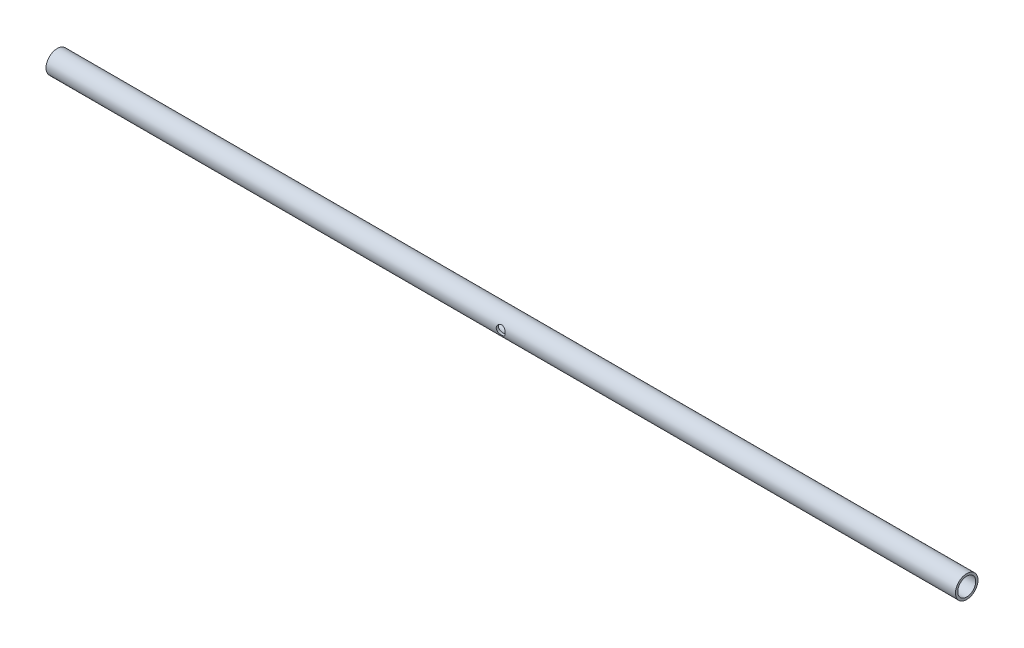
ISO-10303-21;
HEADER;
FILE_DESCRIPTION(('STEP AP214'),'2;1');
FILE_NAME('part.step','',(''),(''),'','','');
FILE_SCHEMA(('AUTOMOTIVE_DESIGN { 1 0 10303 214 1 1 1 1 }'));
ENDSEC;
DATA;
#1=APPLICATION_CONTEXT('core data for automotive mechanical design processes');
#2=APPLICATION_PROTOCOL_DEFINITION('international standard','automotive_design',2000,#1);
#3=PRODUCT_CONTEXT('',#1,'mechanical');
#4=PRODUCT('Part','Part','',(#3));
#5=PRODUCT_RELATED_PRODUCT_CATEGORY('part','',(#4));
#6=PRODUCT_DEFINITION_FORMATION('','',#4);
#7=PRODUCT_DEFINITION_CONTEXT('part definition',#1,'design');
#8=PRODUCT_DEFINITION('design','',#6,#7);
#9=PRODUCT_DEFINITION_SHAPE('','',#8);
#10=(LENGTH_UNIT() NAMED_UNIT(*) SI_UNIT(.MILLI.,.METRE.));
#11=(NAMED_UNIT(*) PLANE_ANGLE_UNIT() SI_UNIT($,.RADIAN.));
#12=(NAMED_UNIT(*) SI_UNIT($,.STERADIAN.) SOLID_ANGLE_UNIT());
#13=UNCERTAINTY_MEASURE_WITH_UNIT(LENGTH_MEASURE(1.E-05),#10,'distance_accuracy_value','');
#14=(GEOMETRIC_REPRESENTATION_CONTEXT(3) GLOBAL_UNCERTAINTY_ASSIGNED_CONTEXT((#13)) GLOBAL_UNIT_ASSIGNED_CONTEXT((#10,
#11,#12)) REPRESENTATION_CONTEXT('',''));
#15=CARTESIAN_POINT('',(0.,0.,0.));
#16=DIRECTION('',(0.,0.,1.));
#17=DIRECTION('',(1.,0.,0.));
#18=AXIS2_PLACEMENT_3D('',#15,#16,#17);
#19=CARTESIAN_POINT('',(201.975,0.,0.));
#20=DIRECTION('',(1.,0.,0.));
#21=DIRECTION('',(0.,0.,-1.));
#22=AXIS2_PLACEMENT_3D('',#19,#20,#21);
#23=PLANE('',#22);
#24=CARTESIAN_POINT('',(201.975,0.,0.));
#25=DIRECTION('',(1.,0.,0.));
#26=DIRECTION('',(0.,0.,-1.));
#27=AXIS2_PLACEMENT_3D('',#24,#25,#26);
#28=CIRCLE('',#27,5.);
#29=CARTESIAN_POINT('',(201.975,0.,-5.));
#30=VERTEX_POINT('',#29);
#31=EDGE_CURVE('E10',#30,#30,#28,.T.);
#32=ORIENTED_EDGE('',*,*,#31,.T.);
#33=EDGE_LOOP('',(#32));
#34=FACE_BOUND('',#33,.T.);
#35=CARTESIAN_POINT('',(201.975,0.,0.));
#36=DIRECTION('',(1.,0.,0.));
#37=DIRECTION('',(0.,0.,-1.));
#38=AXIS2_PLACEMENT_3D('',#35,#36,#37);
#39=CIRCLE('',#38,4.);
#40=CARTESIAN_POINT('',(201.975,0.,-4.));
#41=VERTEX_POINT('',#40);
#42=EDGE_CURVE('E58',#41,#41,#39,.T.);
#43=ORIENTED_EDGE('',*,*,#42,.F.);
#44=EDGE_LOOP('',(#43));
#45=FACE_BOUND('',#44,.T.);
#46=ADVANCED_FACE('F37',(#34,#45),#23,.T.);
#47=CARTESIAN_POINT('',(-201.975,0.,0.));
#48=DIRECTION('',(1.,0.,0.));
#49=DIRECTION('',(0.,0.,-1.));
#50=AXIS2_PLACEMENT_3D('',#47,#48,#49);
#51=PLANE('',#50);
#52=CARTESIAN_POINT('',(-201.975,0.,0.));
#53=DIRECTION('',(1.,0.,0.));
#54=DIRECTION('',(0.,0.,-1.));
#55=AXIS2_PLACEMENT_3D('',#52,#53,#54);
#56=CIRCLE('',#55,5.);
#57=CARTESIAN_POINT('',(-201.975,0.,-5.));
#58=VERTEX_POINT('',#57);
#59=EDGE_CURVE('E52',#58,#58,#56,.T.);
#60=ORIENTED_EDGE('',*,*,#59,.F.);
#61=EDGE_LOOP('',(#60));
#62=FACE_BOUND('',#61,.T.);
#63=CARTESIAN_POINT('',(-201.975,0.,0.));
#64=DIRECTION('',(1.,0.,0.));
#65=DIRECTION('',(0.,0.,-1.));
#66=AXIS2_PLACEMENT_3D('',#63,#64,#65);
#67=CIRCLE('',#66,4.);
#68=CARTESIAN_POINT('',(-201.975,0.,-4.));
#69=VERTEX_POINT('',#68);
#70=EDGE_CURVE('E61',#69,#69,#67,.T.);
#71=ORIENTED_EDGE('',*,*,#70,.T.);
#72=EDGE_LOOP('',(#71));
#73=FACE_BOUND('',#72,.T.);
#74=ADVANCED_FACE('F102',(#62,#73),#51,.F.);
#75=CARTESIAN_POINT('',(201.975,0.,0.));
#76=DIRECTION('',(-1.,0.,0.));
#77=DIRECTION('',(0.,0.,1.));
#78=AXIS2_PLACEMENT_3D('',#75,#76,#77);
#79=CYLINDRICAL_SURFACE('',#78,5.);
#80=CARTESIAN_POINT('',(2.,0.,-5.));
#81=CARTESIAN_POINT('',(1.99999014817627,0.107493005442891,-4.99999271227085));
#82=CARTESIAN_POINT('',(1.99128224791162,0.215172564090673,-4.99649294306932));
#83=CARTESIAN_POINT('',(1.95675229647876,0.427496480417896,-4.98283453100641));
#84=CARTESIAN_POINT('',(1.93088372091387,0.532131777561248,-4.97265778698877));
#85=CARTESIAN_POINT('',(1.86312392194117,0.734953922727403,-4.94674209213118));
#86=CARTESIAN_POINT('',(1.82128515378327,0.833160661616959,-4.93102136364072));
#87=CARTESIAN_POINT('',(1.72298082667345,1.02107197032837,-4.89556610796078));
#88=CARTESIAN_POINT('',(1.66652034508107,1.11077947675099,-4.87583297458057));
#89=CARTESIAN_POINT('',(1.53776450143906,1.28350100757039,-4.83330886170419));
#90=CARTESIAN_POINT('',(1.46489334375974,1.36606227255021,-4.8104229692919));
#91=CARTESIAN_POINT('',(1.30659999652322,1.51817500478472,-4.76460576906194));
#92=CARTESIAN_POINT('',(1.22117170278826,1.58772010713353,-4.74167444453792));
#93=CARTESIAN_POINT('',(1.03557192975773,1.71487456729288,-4.69722791797136));
#94=CARTESIAN_POINT('',(0.934913513976802,1.77181498119547,-4.67582115964951));
#95=CARTESIAN_POINT('',(0.724463601579958,1.86775471903715,-4.63833647186793));
#96=CARTESIAN_POINT('',(0.614676472151639,1.90676256428583,-4.62225601244176));
#97=CARTESIAN_POINT('',(0.394287666407897,1.96389882339587,-4.59826357660818));
#98=CARTESIAN_POINT('',(0.283948764423787,1.98289396580565,-4.59001420355605));
#99=CARTESIAN_POINT('',(0.0613650016927322,2.00217296164003,-4.58164004049144));
#100=CARTESIAN_POINT('',(-0.0508788946250149,2.00246601631322,-4.58151125522768));
#101=CARTESIAN_POINT('',(-0.265756671458044,1.98498936750454,-4.58910500279994));
#102=CARTESIAN_POINT('',(-0.368515714409031,1.96847531430514,-4.5962817503845));
#103=CARTESIAN_POINT('',(-0.569659556006714,1.91994688029782,-4.61676187607836));
#104=CARTESIAN_POINT('',(-0.668043588110308,1.88792979480463,-4.63006632321673));
#105=CARTESIAN_POINT('',(-0.860017836196041,1.80869473255107,-4.6615948508853));
#106=CARTESIAN_POINT('',(-0.95346923905469,1.76117986231532,-4.67991379280788));
#107=CARTESIAN_POINT('',(-1.13141581636156,1.65250646073221,-4.7193811638989));
#108=CARTESIAN_POINT('',(-1.21590760940281,1.59134280510084,-4.74053065456848));
#109=CARTESIAN_POINT('',(-1.380409728802,1.45155059945443,-4.78526736742271));
#110=CARTESIAN_POINT('',(-1.45956872944602,1.37193746297063,-4.80891664976152));
#111=CARTESIAN_POINT('',(-1.60368447800204,1.20031442743019,-4.85459824958282));
#112=CARTESIAN_POINT('',(-1.66863839741029,1.10830206533443,-4.87663024445325));
#113=CARTESIAN_POINT('',(-1.78361744741583,0.912077652605842,-4.91714681264548));
#114=CARTESIAN_POINT('',(-1.83332228119705,0.807660491346477,-4.93555270095415));
#115=CARTESIAN_POINT('',(-1.91416786107806,0.591023765482882,-4.96614828328759));
#116=CARTESIAN_POINT('',(-1.94531803755741,0.478808196849674,-4.97834113462382));
#117=CARTESIAN_POINT('',(-1.9864482954197,0.25689588760782,-4.99456139506911));
#118=CARTESIAN_POINT('',(-1.99757245425356,0.147443293985535,-4.99902945833514));
#119=CARTESIAN_POINT('',(-2.00171310052861,-0.0718453098078171,-5.00068478510631));
#120=CARTESIAN_POINT('',(-1.99473428154751,-0.181681213223923,-4.99787393582291));
#121=CARTESIAN_POINT('',(-1.96370824744801,-0.393432739121987,-4.98557567063753));
#122=CARTESIAN_POINT('',(-1.94044201964902,-0.495482491775474,-4.97639391345523));
#123=CARTESIAN_POINT('',(-1.87856429169019,-0.69413542806078,-4.952594414055));
#124=CARTESIAN_POINT('',(-1.83995082033132,-0.790737910224844,-4.9379759735653));
#125=CARTESIAN_POINT('',(-1.74721506032005,-0.979078785816702,-4.90416594770812));
#126=CARTESIAN_POINT('',(-1.69265452795685,-1.07057802275541,-4.88484815979804));
#127=CARTESIAN_POINT('',(-1.57005967609436,-1.24344359124656,-4.84373364745525));
#128=CARTESIAN_POINT('',(-1.50201995707739,-1.32480584076113,-4.8219359311027));
#129=CARTESIAN_POINT('',(-1.34912998705037,-1.48072304302882,-4.77645117638112));
#130=CARTESIAN_POINT('',(-1.26346645849379,-1.55447393380606,-4.75273441425052));
#131=CARTESIAN_POINT('',(-1.08055991699063,-1.68675119741371,-4.70741672917132));
#132=CARTESIAN_POINT('',(-0.983314999660052,-1.74527506133751,-4.68581615526511));
#133=CARTESIAN_POINT('',(-0.778538305405895,-1.84580750193163,-4.64714299907709));
#134=CARTESIAN_POINT('',(-0.67091600078769,-1.88765059453445,-4.63011630884788));
#135=CARTESIAN_POINT('',(-0.449266348284846,-1.9522962197053,-4.60323673477931));
#136=CARTESIAN_POINT('',(-0.335243794187575,-1.97511280526931,-4.59337855695998));
#137=CARTESIAN_POINT('',(-0.112872098225457,-1.9997156172784,-4.58271759299926));
#138=CARTESIAN_POINT('',(-0.0047051604066488,-2.00289708230287,-4.58131421008171));
#139=CARTESIAN_POINT('',(0.210544857713294,-1.99180315927752,-4.58614836033098));
#140=CARTESIAN_POINT('',(0.317628073902584,-1.97752998791378,-4.59238492324794));
#141=CARTESIAN_POINT('',(0.523332189855041,-1.93307136615365,-4.61126649079021));
#142=CARTESIAN_POINT('',(0.622120274432998,-1.90353749357098,-4.62364831827449));
#143=CARTESIAN_POINT('',(0.813378629613482,-1.83000544849101,-4.65324001232696));
#144=CARTESIAN_POINT('',(0.905847146899825,-1.78600328139381,-4.67045121206007));
#145=CARTESIAN_POINT('',(1.08760961927078,-1.68187276275973,-4.70898609604491));
#146=CARTESIAN_POINT('',(1.17641867013048,-1.62096533515949,-4.73048882313242));
#147=CARTESIAN_POINT('',(1.34299331720375,-1.4858921192715,-4.77463804372237));
#148=CARTESIAN_POINT('',(1.42075557212831,-1.41172233481812,-4.79728488048406));
#149=CARTESIAN_POINT('',(1.56820285326361,-1.24650550627246,-4.84293567087394));
#150=CARTESIAN_POINT('',(1.63703730689807,-1.15467600114614,-4.86586757962185));
#151=CARTESIAN_POINT('',(1.75833704262164,-0.959900320285779,-4.90800406713717));
#152=CARTESIAN_POINT('',(1.81079471215253,-0.856949004547237,-4.92720691092906));
#153=CARTESIAN_POINT('',(1.89662221519029,-0.644738062495203,-4.95939714815861));
#154=CARTESIAN_POINT('',(1.93032932356034,-0.535631618219697,-4.97249363055028));
#155=CARTESIAN_POINT('',(1.97863912095427,-0.312876546281222,-4.99144306209366));
#156=CARTESIAN_POINT('',(1.9933024367439,-0.199243525858913,-4.99731899495638));
#157=CARTESIAN_POINT('',(1.99939538097827,-0.05691229789093,-4.99975899504136));
#158=CARTESIAN_POINT('',(2.00000260862919,-0.0284626887407585,-5.00000192969176));
#159=CARTESIAN_POINT('',(2.,0.,-5.));
#160=B_SPLINE_CURVE_WITH_KNOTS('',3,(#80,#81,#82,#83,#84,#85,#86,#87,#88,#89,#90,#91,#92,#93,
#94,#95,#96,#97,#98,#99,#100,#101,#102,#103,#104,#105,#106,#107,#108,#109,#110,#111,#112,#113,
#114,#115,#116,#117,#118,#119,#120,#121,#122,#123,#124,#125,#126,#127,#128,#129,#130,#131,#132,
#133,#134,#135,#136,#137,#138,#139,#140,#141,#142,#143,#144,#145,#146,#147,#148,#149,#150,#151,
#152,#153,#154,#155,#156,#157,#158,#159),.UNSPECIFIED.,.T.,.F.,(4,2,2,2,2,2,2,2,2,2,2,2,2,2,2,2,
2,2,2,2,2,2,2,2,2,2,2,2,2,2,2,2,2,2,2,2,2,2,2,4),(0.,0.322402987893071,0.645683636007934,
0.967911457471581,1.29002753567984,1.62597381700397,1.96208394934411,2.31315258819217,
2.66405423118268,2.99904105308829,3.33386306340488,3.64538328401372,3.95695787256047,
4.27489126298816,4.59294421938183,4.93558349186557,5.27829092839733,5.62776913162806,
5.9770695611379,6.30569184528007,6.63422893570082,6.94800455564365,7.26182048993797,
7.58523513398263,7.90877959498969,8.25368474624414,8.59864669043748,8.94695045140827,
9.29499672645934,9.61799673392748,9.94095572563046,10.2511431854877,10.5614163580516,
10.8894546805669,11.2175920134839,11.5670042353384,11.9165786364053,12.2596430101332,
12.6016125240434,12.686980458968),.UNSPECIFIED.);
#161=CARTESIAN_POINT('',(2.,0.,-5.));
#162=VERTEX_POINT('',#161);
#163=EDGE_CURVE('E88',#162,#162,#160,.T.);
#164=ORIENTED_EDGE('',*,*,#163,.T.);
#165=EDGE_LOOP('',(#164));
#166=FACE_BOUND('',#165,.T.);
#167=CARTESIAN_POINT('',(2.,0.,5.));
#168=CARTESIAN_POINT('',(1.99999014817627,-0.107493005442891,4.99999271227085));
#169=CARTESIAN_POINT('',(1.99128224791162,-0.215172564090673,4.99649294306932));
#170=CARTESIAN_POINT('',(1.95675229647876,-0.427496480417896,4.98283453100641));
#171=CARTESIAN_POINT('',(1.93088372091387,-0.532131777561248,4.97265778698877));
#172=CARTESIAN_POINT('',(1.86312392194117,-0.734953922727403,4.94674209213118));
#173=CARTESIAN_POINT('',(1.82128515378327,-0.833160661616959,4.93102136364072));
#174=CARTESIAN_POINT('',(1.72298082667345,-1.02107197032837,4.89556610796078));
#175=CARTESIAN_POINT('',(1.66652034508107,-1.11077947675099,4.87583297458057));
#176=CARTESIAN_POINT('',(1.53776450143906,-1.28350100757039,4.83330886170419));
#177=CARTESIAN_POINT('',(1.46489334375974,-1.36606227255021,4.8104229692919));
#178=CARTESIAN_POINT('',(1.30659999652322,-1.51817500478472,4.76460576906194));
#179=CARTESIAN_POINT('',(1.22117170278826,-1.58772010713353,4.74167444453792));
#180=CARTESIAN_POINT('',(1.03557192975773,-1.71487456729288,4.69722791797136));
#181=CARTESIAN_POINT('',(0.934913513976802,-1.77181498119547,4.67582115964951));
#182=CARTESIAN_POINT('',(0.724463601579958,-1.86775471903715,4.63833647186793));
#183=CARTESIAN_POINT('',(0.614676472151639,-1.90676256428583,4.62225601244176));
#184=CARTESIAN_POINT('',(0.394287666407897,-1.96389882339587,4.59826357660818));
#185=CARTESIAN_POINT('',(0.283948764423787,-1.98289396580565,4.59001420355605));
#186=CARTESIAN_POINT('',(0.0613650016927322,-2.00217296164003,4.58164004049144));
#187=CARTESIAN_POINT('',(-0.0508788946250149,-2.00246601631322,4.58151125522768));
#188=CARTESIAN_POINT('',(-0.265756671458044,-1.98498936750454,4.58910500279994));
#189=CARTESIAN_POINT('',(-0.368515714409031,-1.96847531430514,4.5962817503845));
#190=CARTESIAN_POINT('',(-0.569659556006714,-1.91994688029782,4.61676187607836));
#191=CARTESIAN_POINT('',(-0.668043588110308,-1.88792979480463,4.63006632321673));
#192=CARTESIAN_POINT('',(-0.860017836196041,-1.80869473255107,4.6615948508853));
#193=CARTESIAN_POINT('',(-0.95346923905469,-1.76117986231532,4.67991379280788));
#194=CARTESIAN_POINT('',(-1.13141581636156,-1.65250646073221,4.7193811638989));
#195=CARTESIAN_POINT('',(-1.21590760940281,-1.59134280510084,4.74053065456848));
#196=CARTESIAN_POINT('',(-1.380409728802,-1.45155059945443,4.78526736742271));
#197=CARTESIAN_POINT('',(-1.45956872944602,-1.37193746297063,4.80891664976152));
#198=CARTESIAN_POINT('',(-1.60368447800204,-1.20031442743019,4.85459824958282));
#199=CARTESIAN_POINT('',(-1.66863839741029,-1.10830206533443,4.87663024445325));
#200=CARTESIAN_POINT('',(-1.78361744741583,-0.912077652605842,4.91714681264548));
#201=CARTESIAN_POINT('',(-1.83332228119705,-0.807660491346477,4.93555270095415));
#202=CARTESIAN_POINT('',(-1.91416786107806,-0.591023765482882,4.96614828328759));
#203=CARTESIAN_POINT('',(-1.94531803755741,-0.478808196849674,4.97834113462382));
#204=CARTESIAN_POINT('',(-1.9864482954197,-0.25689588760782,4.99456139506911));
#205=CARTESIAN_POINT('',(-1.99757245425356,-0.147443293985535,4.99902945833514));
#206=CARTESIAN_POINT('',(-2.00171310052861,0.0718453098078171,5.00068478510631));
#207=CARTESIAN_POINT('',(-1.99473428154751,0.181681213223923,4.99787393582291));
#208=CARTESIAN_POINT('',(-1.96370824744801,0.393432739121987,4.98557567063753));
#209=CARTESIAN_POINT('',(-1.94044201964902,0.495482491775474,4.97639391345523));
#210=CARTESIAN_POINT('',(-1.87856429169019,0.69413542806078,4.952594414055));
#211=CARTESIAN_POINT('',(-1.83995082033132,0.790737910224844,4.9379759735653));
#212=CARTESIAN_POINT('',(-1.74721506032005,0.979078785816702,4.90416594770812));
#213=CARTESIAN_POINT('',(-1.69265452795685,1.07057802275541,4.88484815979804));
#214=CARTESIAN_POINT('',(-1.57005967609436,1.24344359124656,4.84373364745525));
#215=CARTESIAN_POINT('',(-1.50201995707739,1.32480584076113,4.8219359311027));
#216=CARTESIAN_POINT('',(-1.34912998705037,1.48072304302882,4.77645117638112));
#217=CARTESIAN_POINT('',(-1.26346645849379,1.55447393380606,4.75273441425052));
#218=CARTESIAN_POINT('',(-1.08055991699063,1.68675119741371,4.70741672917132));
#219=CARTESIAN_POINT('',(-0.983314999660052,1.74527506133751,4.68581615526511));
#220=CARTESIAN_POINT('',(-0.778538305405895,1.84580750193163,4.64714299907709));
#221=CARTESIAN_POINT('',(-0.67091600078769,1.88765059453445,4.63011630884788));
#222=CARTESIAN_POINT('',(-0.449266348284846,1.9522962197053,4.60323673477931));
#223=CARTESIAN_POINT('',(-0.335243794187575,1.97511280526931,4.59337855695998));
#224=CARTESIAN_POINT('',(-0.112872098225457,1.9997156172784,4.58271759299926));
#225=CARTESIAN_POINT('',(-0.0047051604066488,2.00289708230287,4.58131421008171));
#226=CARTESIAN_POINT('',(0.210544857713294,1.99180315927752,4.58614836033098));
#227=CARTESIAN_POINT('',(0.317628073902584,1.97752998791378,4.59238492324794));
#228=CARTESIAN_POINT('',(0.523332189855041,1.93307136615365,4.61126649079021));
#229=CARTESIAN_POINT('',(0.622120274432998,1.90353749357098,4.62364831827449));
#230=CARTESIAN_POINT('',(0.813378629613482,1.83000544849101,4.65324001232696));
#231=CARTESIAN_POINT('',(0.905847146899825,1.78600328139381,4.67045121206007));
#232=CARTESIAN_POINT('',(1.08760961927078,1.68187276275973,4.70898609604491));
#233=CARTESIAN_POINT('',(1.17641867013048,1.62096533515949,4.73048882313242));
#234=CARTESIAN_POINT('',(1.34299331720375,1.4858921192715,4.77463804372237));
#235=CARTESIAN_POINT('',(1.42075557212831,1.41172233481812,4.79728488048406));
#236=CARTESIAN_POINT('',(1.56820285326361,1.24650550627246,4.84293567087394));
#237=CARTESIAN_POINT('',(1.63703730689807,1.15467600114614,4.86586757962185));
#238=CARTESIAN_POINT('',(1.75833704262164,0.959900320285779,4.90800406713717));
#239=CARTESIAN_POINT('',(1.81079471215253,0.856949004547237,4.92720691092906));
#240=CARTESIAN_POINT('',(1.89662221519029,0.644738062495203,4.95939714815861));
#241=CARTESIAN_POINT('',(1.93032932356034,0.535631618219697,4.97249363055028));
#242=CARTESIAN_POINT('',(1.97863912095427,0.312876546281222,4.99144306209366));
#243=CARTESIAN_POINT('',(1.9933024367439,0.199243525858913,4.99731899495638));
#244=CARTESIAN_POINT('',(1.99939538097827,0.05691229789093,4.99975899504136));
#245=CARTESIAN_POINT('',(2.00000260862919,0.0284626887407585,5.00000192969176));
#246=CARTESIAN_POINT('',(2.,0.,5.));
#247=B_SPLINE_CURVE_WITH_KNOTS('',3,(#167,#168,#169,#170,#171,#172,#173,#174,#175,#176,#177,
#178,#179,#180,#181,#182,#183,#184,#185,#186,#187,#188,#189,#190,#191,#192,#193,#194,#195,#196,
#197,#198,#199,#200,#201,#202,#203,#204,#205,#206,#207,#208,#209,#210,#211,#212,#213,#214,#215,
#216,#217,#218,#219,#220,#221,#222,#223,#224,#225,#226,#227,#228,#229,#230,#231,#232,#233,#234,
#235,#236,#237,#238,#239,#240,#241,#242,#243,#244,#245,#246),.UNSPECIFIED.,.T.,.F.,(4,2,2,2,2,2,
2,2,2,2,2,2,2,2,2,2,2,2,2,2,2,2,2,2,2,2,2,2,2,2,2,2,2,2,2,2,2,2,2,4),(0.,0.322402987893071,
0.645683636007934,0.967911457471581,1.29002753567984,1.62597381700397,1.96208394934411,
2.31315258819217,2.66405423118268,2.99904105308829,3.33386306340488,3.64538328401372,
3.95695787256047,4.27489126298816,4.59294421938183,4.93558349186557,5.27829092839733,
5.62776913162806,5.9770695611379,6.30569184528007,6.63422893570082,6.94800455564365,
7.26182048993797,7.58523513398263,7.90877959498969,8.25368474624414,8.59864669043748,
8.94695045140827,9.29499672645934,9.61799673392748,9.94095572563046,10.2511431854877,
10.5614163580516,10.8894546805669,11.2175920134839,11.5670042353384,11.9165786364053,
12.2596430101332,12.6016125240434,12.686980458968),.UNSPECIFIED.);
#248=CARTESIAN_POINT('',(2.,0.,5.));
#249=VERTEX_POINT('',#248);
#250=EDGE_CURVE('E82',#249,#249,#247,.T.);
#251=ORIENTED_EDGE('',*,*,#250,.T.);
#252=EDGE_LOOP('',(#251));
#253=FACE_BOUND('',#252,.T.);
#254=ORIENTED_EDGE('',*,*,#31,.F.);
#255=EDGE_LOOP('',(#254));
#256=FACE_BOUND('',#255,.T.);
#257=ORIENTED_EDGE('',*,*,#59,.T.);
#258=EDGE_LOOP('',(#257));
#259=FACE_BOUND('',#258,.T.);
#260=ADVANCED_FACE('F39',(#166,#253,#256,#259),#79,.T.);
#261=CARTESIAN_POINT('',(201.975,0.,0.));
#262=DIRECTION('',(-1.,0.,0.));
#263=DIRECTION('',(0.,0.,1.));
#264=AXIS2_PLACEMENT_3D('',#261,#262,#263);
#265=CYLINDRICAL_SURFACE('',#264,4.);
#266=CARTESIAN_POINT('',(2.,0.,4.));
#267=CARTESIAN_POINT('',(1.99999339536562,-0.105143925902467,3.99999426810082));
#268=CARTESIAN_POINT('',(1.99165985375789,-0.210413199395125,3.99580982039513));
#269=CARTESIAN_POINT('',(1.95869423931692,-0.417840470537792,3.97948312074314));
#270=CARTESIAN_POINT('',(1.93403121400437,-0.519992173427259,3.96732575657839));
#271=CARTESIAN_POINT('',(1.86961238276674,-0.717867089760898,3.93632558806751));
#272=CARTESIAN_POINT('',(1.82991523150406,-0.813613605878292,3.91750878355075));
#273=CARTESIAN_POINT('',(1.73685875727003,-0.996945233613197,3.87491553031523));
#274=CARTESIAN_POINT('',(1.68350051150227,-1.08453098798012,3.8511394726705));
#275=CARTESIAN_POINT('',(1.56096550102943,-1.25501563552382,3.79912516516124));
#276=CARTESIAN_POINT('',(1.49102704152072,-1.33731042224422,3.77070398255074));
#277=CARTESIAN_POINT('',(1.33895704150593,-1.48955888973396,3.71319940493486));
#278=CARTESIAN_POINT('',(1.25681629645512,-1.55950316621353,3.68411552418069));
#279=CARTESIAN_POINT('',(1.07503330095324,-1.69050400090056,3.62597902394695));
#280=CARTESIAN_POINT('',(0.974527803308175,-1.75045067110327,3.59710373940264));
#281=CARTESIAN_POINT('',(0.763265328027571,-1.85233645378139,3.54571957544641));
#282=CARTESIAN_POINT('',(0.652515742554502,-1.89428842993267,3.52320615213979));
#283=CARTESIAN_POINT('',(0.430669789156155,-1.95626488437718,3.48915734075617));
#284=CARTESIAN_POINT('',(0.319991095865212,-1.97745171416088,3.47704543167427));
#285=CARTESIAN_POINT('',(0.0960423244410466,-2.00085398661769,3.46363779897055));
#286=CARTESIAN_POINT('',(-0.0172250817423092,-2.00308817674615,3.46233138686576));
#287=CARTESIAN_POINT('',(-0.228572048630736,-1.98937457434459,3.47021860514497));
#288=CARTESIAN_POINT('',(-0.3268480624461,-1.97556911907364,3.47817527324027));
#289=CARTESIAN_POINT('',(-0.519443818746084,-1.93387969811386,3.50152457467701));
#290=CARTESIAN_POINT('',(-0.613762290610631,-1.9059912477953,3.51691957663553));
#291=CARTESIAN_POINT('',(-0.798458265131318,-1.83641956077201,3.55374952825482));
#292=CARTESIAN_POINT('',(-0.888692797571577,-1.79443013423199,3.57531681327997));
#293=CARTESIAN_POINT('',(-1.06126858518002,-1.698083375336,3.62206808562807));
#294=CARTESIAN_POINT('',(-1.14360627120018,-1.64372048762493,3.64725369560381));
#295=CARTESIAN_POINT('',(-1.30904250548645,-1.51613210982558,3.70226315806572));
#296=CARTESIAN_POINT('',(-1.39091374715231,-1.44138891673856,3.73227020473492));
#297=CARTESIAN_POINT('',(-1.5414708371818,-1.27911115748275,3.79095246600814));
#298=CARTESIAN_POINT('',(-1.61015038406777,-1.19157051314857,3.81962703917602));
#299=CARTESIAN_POINT('',(-1.73537132205945,-1.0010330116637,3.87403974565928));
#300=CARTESIAN_POINT('',(-1.79120094489148,-0.897507183198818,3.89957968324015));
#301=CARTESIAN_POINT('',(-1.88419405808602,-0.680932430977594,3.94315762242485));
#302=CARTESIAN_POINT('',(-1.92137237003033,-0.567891152530552,3.96120157887106));
#303=CARTESIAN_POINT('',(-1.97295080743335,-0.345532983321405,3.98648667482871));
#304=CARTESIAN_POINT('',(-1.98898247149356,-0.236683061096652,3.9944987660262));
#305=CARTESIAN_POINT('',(-2.00292946226897,-0.0175591998987033,4.00146026918207));
#306=CARTESIAN_POINT('',(-2.00085337127894,0.0927140397398172,4.00041397442637));
#307=CARTESIAN_POINT('',(-1.97958662316251,0.302465943971974,3.9898238450687));
#308=CARTESIAN_POINT('',(-1.96173493454001,0.40211881609986,3.98094491376337));
#309=CARTESIAN_POINT('',(-1.91152385620976,0.596813784603882,3.9564434262968));
#310=CARTESIAN_POINT('',(-1.87916286709301,0.691855371382174,3.94082012668824));
#311=CARTESIAN_POINT('',(-1.80000306713393,0.877777216899145,3.90368502827176));
#312=CARTESIAN_POINT('',(-1.75281789976743,0.968460794011607,3.88201763539261));
#313=CARTESIAN_POINT('',(-1.64578492870686,1.14092272339854,3.83487948634835));
#314=CARTESIAN_POINT('',(-1.58593173080921,1.22269725955318,3.80940711133877));
#315=CARTESIAN_POINT('',(-1.44847914933857,1.38353537857843,3.75416442672396));
#316=CARTESIAN_POINT('',(-1.36971426310971,1.46154415563805,3.72421769686998));
#317=CARTESIAN_POINT('',(-1.20014969744454,1.60371264223771,3.6652478321764));
#318=CARTESIAN_POINT('',(-1.10934176230416,1.66786277142375,3.63622534800094));
#319=CARTESIAN_POINT('',(-0.912712691654048,1.78341582895804,3.58102384412979));
#320=CARTESIAN_POINT('',(-0.806377467811037,1.8340509916005,3.55505059178121));
#321=CARTESIAN_POINT('',(-0.584979864850068,1.91616565186941,3.51148144588269));
#322=CARTESIAN_POINT('',(-0.469928947066219,1.94766983173403,3.493874764435));
#323=CARTESIAN_POINT('',(-0.246179554230592,1.98772337493374,3.47123002051604));
#324=CARTESIAN_POINT('',(-0.137931493129517,1.9981859928109,3.4651476693013));
#325=CARTESIAN_POINT('',(0.0788941343290494,2.0013783087524,3.46330709283206));
#326=CARTESIAN_POINT('',(0.187471537475723,1.99411569324648,3.4675443925278));
#327=CARTESIAN_POINT('',(0.390967003066874,1.96385225118662,3.48475724102153));
#328=CARTESIAN_POINT('',(0.486200940289479,1.94241662868607,3.49686188965317));
#329=CARTESIAN_POINT('',(0.671616238848733,1.88635071644882,3.52742032375305));
#330=CARTESIAN_POINT('',(0.761795964184063,1.85171618231984,3.54587615139337));
#331=CARTESIAN_POINT('',(0.941249701973074,1.76763149060113,3.58857060729071));
#332=CARTESIAN_POINT('',(1.03005580365806,1.7173422756314,3.61311444791841));
#333=CARTESIAN_POINT('',(1.19854907236252,1.60430194327478,3.66470663269721));
#334=CARTESIAN_POINT('',(1.27823146104222,1.54154434248312,3.69175627591221));
#335=CARTESIAN_POINT('',(1.43628396470935,1.39640665332275,3.74924646316184));
#336=CARTESIAN_POINT('',(1.51331820470058,1.31256884599452,3.77969966613256));
#337=CARTESIAN_POINT('',(1.65252596687054,1.13230961246639,3.83755504519861));
#338=CARTESIAN_POINT('',(1.71469147893981,1.03588144661039,3.8649555725239));
#339=CARTESIAN_POINT('',(1.82247272542414,0.831863193565891,3.91396019133075));
#340=CARTESIAN_POINT('',(1.86796833847294,0.72419900755346,3.93552192987866));
#341=CARTESIAN_POINT('',(1.93961633551482,0.501484202276172,3.97002682597974));
#342=CARTESIAN_POINT('',(1.96582369361143,0.3864555991782,3.98299446726136));
#343=CARTESIAN_POINT('',(1.98779482217148,0.22520389298179,3.99390923826956));
#344=CARTESIAN_POINT('',(1.99236528173268,0.18032375888313,3.99618730680502));
#345=CARTESIAN_POINT('',(1.99846933102817,0.0903034636101831,3.99923393953631));
#346=CARTESIAN_POINT('',(2.00000283694042,0.0451632952932568,4.00000246206762));
#347=CARTESIAN_POINT('',(2.,0.,4.));
#348=B_SPLINE_CURVE_WITH_KNOTS('',3,(#266,#267,#268,#269,#270,#271,#272,#273,#274,#275,#276,
#277,#278,#279,#280,#281,#282,#283,#284,#285,#286,#287,#288,#289,#290,#291,#292,#293,#294,#295,
#296,#297,#298,#299,#300,#301,#302,#303,#304,#305,#306,#307,#308,#309,#310,#311,#312,#313,#314,
#315,#316,#317,#318,#319,#320,#321,#322,#323,#324,#325,#326,#327,#328,#329,#330,#331,#332,#333,
#334,#335,#336,#337,#338,#339,#340,#341,#342,#343,#344,#345,#346,#347),.UNSPECIFIED.,.T.,.F.,(4,
2,2,2,2,2,2,2,2,2,2,2,2,2,2,2,2,2,2,2,2,2,2,2,2,2,2,2,2,2,2,2,2,2,2,2,2,2,2,2,4),(0.,
0.315248514840585,0.631096299418395,0.945724310984597,1.26032752116314,1.59396351743618,
1.92785247530807,2.28763452861505,2.64715895796562,2.98516024280459,3.32282714658041,
3.62011424818641,3.91749607851357,4.22180480336975,4.52625042520444,4.86929882667757,
5.21251069197373,5.57166044428881,5.93052433824559,6.25966580942691,6.58865129022952,
6.89213813012244,7.19565843261863,7.50785712055797,7.82018901496679,8.16319221288838,
8.50643177230864,8.86629364323452,9.22569023890902,9.55058615006093,9.87534119729357,
10.1691586049771,10.463070575767,10.7767291356057,11.0905512228726,11.4425048551434,
11.7946476676249,12.1492802732705,12.502898172423,12.6383056026783,12.7737167702213),.UNSPECIFIED.);
#349=CARTESIAN_POINT('',(2.,0.,4.));
#350=VERTEX_POINT('',#349);
#351=EDGE_CURVE('E42',#350,#350,#348,.T.);
#352=ORIENTED_EDGE('',*,*,#351,.F.);
#353=EDGE_LOOP('',(#352));
#354=FACE_BOUND('',#353,.T.);
#355=CARTESIAN_POINT('',(2.,0.,-4.));
#356=CARTESIAN_POINT('',(1.99999339536562,0.105143925902467,-3.99999426810082));
#357=CARTESIAN_POINT('',(1.99165985375789,0.210413199395125,-3.99580982039513));
#358=CARTESIAN_POINT('',(1.95869423931692,0.417840470537792,-3.97948312074314));
#359=CARTESIAN_POINT('',(1.93403121400437,0.519992173427259,-3.96732575657839));
#360=CARTESIAN_POINT('',(1.86961238276674,0.717867089760898,-3.93632558806751));
#361=CARTESIAN_POINT('',(1.82991523150406,0.813613605878292,-3.91750878355075));
#362=CARTESIAN_POINT('',(1.73685875727003,0.996945233613197,-3.87491553031523));
#363=CARTESIAN_POINT('',(1.68350051150227,1.08453098798012,-3.8511394726705));
#364=CARTESIAN_POINT('',(1.56096550102943,1.25501563552382,-3.79912516516124));
#365=CARTESIAN_POINT('',(1.49102704152072,1.33731042224422,-3.77070398255074));
#366=CARTESIAN_POINT('',(1.33895704150593,1.48955888973396,-3.71319940493486));
#367=CARTESIAN_POINT('',(1.25681629645512,1.55950316621353,-3.68411552418069));
#368=CARTESIAN_POINT('',(1.07503330095324,1.69050400090056,-3.62597902394695));
#369=CARTESIAN_POINT('',(0.974527803308175,1.75045067110327,-3.59710373940264));
#370=CARTESIAN_POINT('',(0.763265328027571,1.85233645378139,-3.54571957544641));
#371=CARTESIAN_POINT('',(0.652515742554502,1.89428842993267,-3.52320615213979));
#372=CARTESIAN_POINT('',(0.430669789156155,1.95626488437718,-3.48915734075617));
#373=CARTESIAN_POINT('',(0.319991095865212,1.97745171416088,-3.47704543167427));
#374=CARTESIAN_POINT('',(0.0960423244410466,2.00085398661769,-3.46363779897055));
#375=CARTESIAN_POINT('',(-0.0172250817423092,2.00308817674615,-3.46233138686576));
#376=CARTESIAN_POINT('',(-0.228572048630736,1.98937457434459,-3.47021860514497));
#377=CARTESIAN_POINT('',(-0.3268480624461,1.97556911907364,-3.47817527324027));
#378=CARTESIAN_POINT('',(-0.519443818746084,1.93387969811386,-3.50152457467701));
#379=CARTESIAN_POINT('',(-0.613762290610631,1.9059912477953,-3.51691957663553));
#380=CARTESIAN_POINT('',(-0.798458265131318,1.83641956077201,-3.55374952825482));
#381=CARTESIAN_POINT('',(-0.888692797571577,1.79443013423199,-3.57531681327997));
#382=CARTESIAN_POINT('',(-1.06126858518002,1.698083375336,-3.62206808562807));
#383=CARTESIAN_POINT('',(-1.14360627120018,1.64372048762493,-3.64725369560381));
#384=CARTESIAN_POINT('',(-1.30904250548645,1.51613210982558,-3.70226315806572));
#385=CARTESIAN_POINT('',(-1.39091374715231,1.44138891673856,-3.73227020473492));
#386=CARTESIAN_POINT('',(-1.5414708371818,1.27911115748275,-3.79095246600814));
#387=CARTESIAN_POINT('',(-1.61015038406777,1.19157051314857,-3.81962703917602));
#388=CARTESIAN_POINT('',(-1.73537132205945,1.0010330116637,-3.87403974565928));
#389=CARTESIAN_POINT('',(-1.79120094489148,0.897507183198818,-3.89957968324015));
#390=CARTESIAN_POINT('',(-1.88419405808602,0.680932430977594,-3.94315762242485));
#391=CARTESIAN_POINT('',(-1.92137237003033,0.567891152530552,-3.96120157887106));
#392=CARTESIAN_POINT('',(-1.97295080743335,0.345532983321405,-3.98648667482871));
#393=CARTESIAN_POINT('',(-1.98898247149356,0.236683061096652,-3.9944987660262));
#394=CARTESIAN_POINT('',(-2.00292946226897,0.0175591998987033,-4.00146026918207));
#395=CARTESIAN_POINT('',(-2.00085337127894,-0.0927140397398172,-4.00041397442637));
#396=CARTESIAN_POINT('',(-1.97958662316251,-0.302465943971974,-3.9898238450687));
#397=CARTESIAN_POINT('',(-1.96173493454001,-0.40211881609986,-3.98094491376337));
#398=CARTESIAN_POINT('',(-1.91152385620976,-0.596813784603882,-3.9564434262968));
#399=CARTESIAN_POINT('',(-1.87916286709301,-0.691855371382174,-3.94082012668824));
#400=CARTESIAN_POINT('',(-1.80000306713393,-0.877777216899145,-3.90368502827176));
#401=CARTESIAN_POINT('',(-1.75281789976743,-0.968460794011607,-3.88201763539261));
#402=CARTESIAN_POINT('',(-1.64578492870686,-1.14092272339854,-3.83487948634835));
#403=CARTESIAN_POINT('',(-1.58593173080921,-1.22269725955318,-3.80940711133877));
#404=CARTESIAN_POINT('',(-1.44847914933857,-1.38353537857843,-3.75416442672396));
#405=CARTESIAN_POINT('',(-1.36971426310971,-1.46154415563805,-3.72421769686998));
#406=CARTESIAN_POINT('',(-1.20014969744454,-1.60371264223771,-3.6652478321764));
#407=CARTESIAN_POINT('',(-1.10934176230416,-1.66786277142375,-3.63622534800094));
#408=CARTESIAN_POINT('',(-0.912712691654048,-1.78341582895804,-3.58102384412979));
#409=CARTESIAN_POINT('',(-0.806377467811037,-1.8340509916005,-3.55505059178121));
#410=CARTESIAN_POINT('',(-0.584979864850068,-1.91616565186941,-3.51148144588269));
#411=CARTESIAN_POINT('',(-0.469928947066219,-1.94766983173403,-3.493874764435));
#412=CARTESIAN_POINT('',(-0.246179554230592,-1.98772337493374,-3.47123002051604));
#413=CARTESIAN_POINT('',(-0.137931493129517,-1.9981859928109,-3.4651476693013));
#414=CARTESIAN_POINT('',(0.0788941343290494,-2.0013783087524,-3.46330709283206));
#415=CARTESIAN_POINT('',(0.187471537475723,-1.99411569324648,-3.4675443925278));
#416=CARTESIAN_POINT('',(0.390967003066874,-1.96385225118662,-3.48475724102153));
#417=CARTESIAN_POINT('',(0.486200940289479,-1.94241662868607,-3.49686188965317));
#418=CARTESIAN_POINT('',(0.671616238848733,-1.88635071644882,-3.52742032375305));
#419=CARTESIAN_POINT('',(0.761795964184063,-1.85171618231984,-3.54587615139337));
#420=CARTESIAN_POINT('',(0.941249701973074,-1.76763149060113,-3.58857060729071));
#421=CARTESIAN_POINT('',(1.03005580365806,-1.7173422756314,-3.61311444791841));
#422=CARTESIAN_POINT('',(1.19854907236252,-1.60430194327478,-3.66470663269721));
#423=CARTESIAN_POINT('',(1.27823146104222,-1.54154434248312,-3.69175627591221));
#424=CARTESIAN_POINT('',(1.43628396470935,-1.39640665332275,-3.74924646316184));
#425=CARTESIAN_POINT('',(1.51331820470058,-1.31256884599452,-3.77969966613256));
#426=CARTESIAN_POINT('',(1.65252596687054,-1.13230961246639,-3.83755504519861));
#427=CARTESIAN_POINT('',(1.71469147893981,-1.03588144661039,-3.8649555725239));
#428=CARTESIAN_POINT('',(1.82247272542414,-0.831863193565891,-3.91396019133075));
#429=CARTESIAN_POINT('',(1.86796833847294,-0.72419900755346,-3.93552192987866));
#430=CARTESIAN_POINT('',(1.93961633551482,-0.501484202276172,-3.97002682597974));
#431=CARTESIAN_POINT('',(1.96582369361143,-0.3864555991782,-3.98299446726136));
#432=CARTESIAN_POINT('',(1.98779482217148,-0.22520389298179,-3.99390923826956));
#433=CARTESIAN_POINT('',(1.99236528173268,-0.18032375888313,-3.99618730680502));
#434=CARTESIAN_POINT('',(1.99846933102817,-0.0903034636101831,-3.99923393953631));
#435=CARTESIAN_POINT('',(2.00000283694042,-0.0451632952932568,-4.00000246206762));
#436=CARTESIAN_POINT('',(2.,0.,-4.));
#437=B_SPLINE_CURVE_WITH_KNOTS('',3,(#355,#356,#357,#358,#359,#360,#361,#362,#363,#364,#365,
#366,#367,#368,#369,#370,#371,#372,#373,#374,#375,#376,#377,#378,#379,#380,#381,#382,#383,#384,
#385,#386,#387,#388,#389,#390,#391,#392,#393,#394,#395,#396,#397,#398,#399,#400,#401,#402,#403,
#404,#405,#406,#407,#408,#409,#410,#411,#412,#413,#414,#415,#416,#417,#418,#419,#420,#421,#422,
#423,#424,#425,#426,#427,#428,#429,#430,#431,#432,#433,#434,#435,#436),.UNSPECIFIED.,.T.,.F.,(4,
2,2,2,2,2,2,2,2,2,2,2,2,2,2,2,2,2,2,2,2,2,2,2,2,2,2,2,2,2,2,2,2,2,2,2,2,2,2,2,4),(0.,
0.315248514840585,0.631096299418395,0.945724310984597,1.26032752116314,1.59396351743618,
1.92785247530807,2.28763452861505,2.64715895796562,2.98516024280459,3.32282714658041,
3.62011424818641,3.91749607851357,4.22180480336975,4.52625042520444,4.86929882667757,
5.21251069197373,5.57166044428881,5.93052433824559,6.25966580942691,6.58865129022952,
6.89213813012244,7.19565843261863,7.50785712055797,7.82018901496679,8.16319221288838,
8.50643177230864,8.86629364323452,9.22569023890902,9.55058615006093,9.87534119729357,
10.1691586049771,10.463070575767,10.7767291356057,11.0905512228726,11.4425048551434,
11.7946476676249,12.1492802732705,12.502898172423,12.6383056026783,12.7737167702213),.UNSPECIFIED.);
#438=CARTESIAN_POINT('',(2.,0.,-4.));
#439=VERTEX_POINT('',#438);
#440=EDGE_CURVE('E63',#439,#439,#437,.T.);
#441=ORIENTED_EDGE('',*,*,#440,.F.);
#442=EDGE_LOOP('',(#441));
#443=FACE_BOUND('',#442,.T.);
#444=ORIENTED_EDGE('',*,*,#42,.T.);
#445=EDGE_LOOP('',(#444));
#446=FACE_BOUND('',#445,.T.);
#447=ORIENTED_EDGE('',*,*,#70,.F.);
#448=EDGE_LOOP('',(#447));
#449=FACE_BOUND('',#448,.T.);
#450=ADVANCED_FACE('F69',(#354,#443,#446,#449),#265,.F.);
#451=CARTESIAN_POINT('',(0.,0.,-5.));
#452=DIRECTION('',(0.,0.,1.));
#453=DIRECTION('',(1.,0.,0.));
#454=AXIS2_PLACEMENT_3D('',#451,#452,#453);
#455=CYLINDRICAL_SURFACE('',#454,2.);
#456=ORIENTED_EDGE('',*,*,#440,.T.);
#457=EDGE_LOOP('',(#456));
#458=FACE_BOUND('',#457,.T.);
#459=ORIENTED_EDGE('',*,*,#163,.F.);
#460=EDGE_LOOP('',(#459));
#461=FACE_BOUND('',#460,.T.);
#462=ADVANCED_FACE('F72',(#458,#461),#455,.F.);
#463=ORIENTED_EDGE('',*,*,#351,.T.);
#464=EDGE_LOOP('',(#463));
#465=FACE_BOUND('',#464,.T.);
#466=ORIENTED_EDGE('',*,*,#250,.F.);
#467=EDGE_LOOP('',(#466));
#468=FACE_BOUND('',#467,.T.);
#469=ADVANCED_FACE('F75',(#465,#468),#455,.F.);
#470=CLOSED_SHELL('',(#46,#74,#260,#450,#462,#469));
#471=MANIFOLD_SOLID_BREP('B2',#470);
#472=ADVANCED_BREP_SHAPE_REPRESENTATION('',(#18,#471),#14);
#473=SHAPE_DEFINITION_REPRESENTATION(#9,#472);
ENDSEC;
END-ISO-10303-21;
